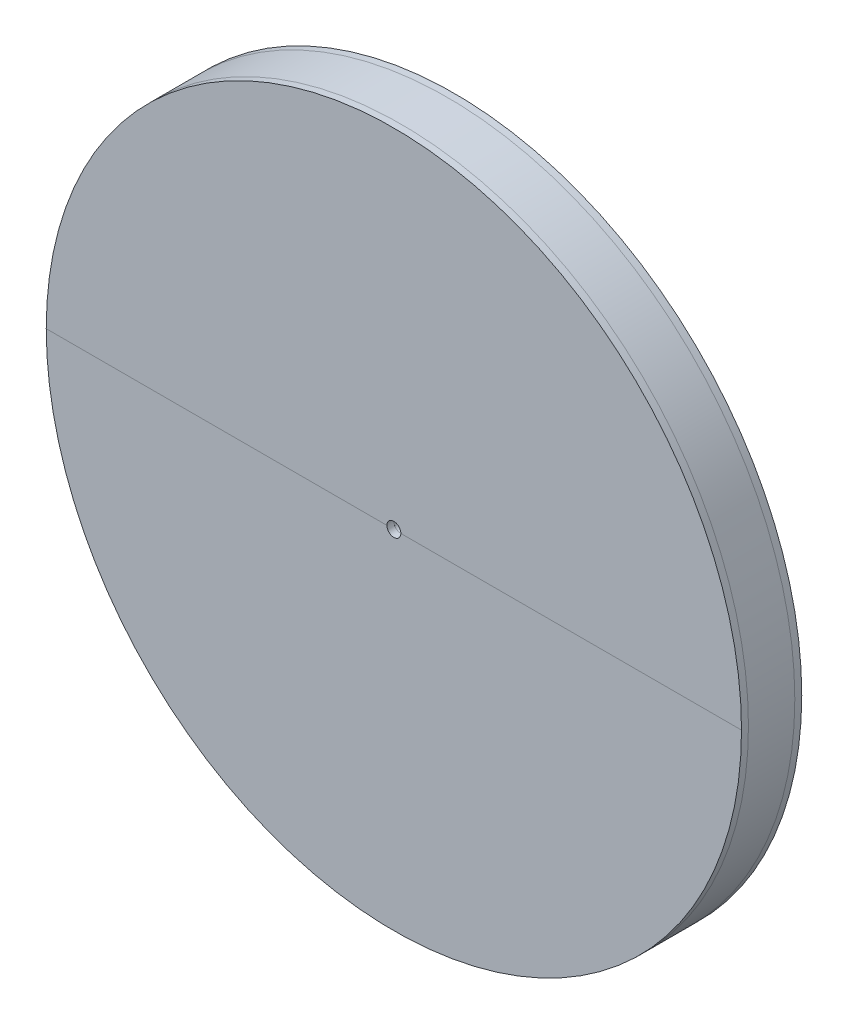
ISO-10303-21;
HEADER;
FILE_DESCRIPTION(('STEP AP214'),'2;1');
FILE_NAME('part.step','',(''),(''),'','','');
FILE_SCHEMA(('AUTOMOTIVE_DESIGN { 1 0 10303 214 1 1 1 1 }'));
ENDSEC;
DATA;
#1=APPLICATION_CONTEXT('core data for automotive mechanical design processes');
#2=APPLICATION_PROTOCOL_DEFINITION('international standard','automotive_design',2000,#1);
#3=PRODUCT_CONTEXT('',#1,'mechanical');
#4=PRODUCT('Part','Part','',(#3));
#5=PRODUCT_RELATED_PRODUCT_CATEGORY('part','',(#4));
#6=PRODUCT_DEFINITION_FORMATION('','',#4);
#7=PRODUCT_DEFINITION_CONTEXT('part definition',#1,'design');
#8=PRODUCT_DEFINITION('design','',#6,#7);
#9=PRODUCT_DEFINITION_SHAPE('','',#8);
#10=(LENGTH_UNIT() NAMED_UNIT(*) SI_UNIT(.MILLI.,.METRE.));
#11=(NAMED_UNIT(*) PLANE_ANGLE_UNIT() SI_UNIT($,.RADIAN.));
#12=(NAMED_UNIT(*) SI_UNIT($,.STERADIAN.) SOLID_ANGLE_UNIT());
#13=UNCERTAINTY_MEASURE_WITH_UNIT(LENGTH_MEASURE(1.E-05),#10,'distance_accuracy_value','');
#14=(GEOMETRIC_REPRESENTATION_CONTEXT(3) GLOBAL_UNCERTAINTY_ASSIGNED_CONTEXT((#13)) GLOBAL_UNIT_ASSIGNED_CONTEXT((#10,
#11,#12)) REPRESENTATION_CONTEXT('',''));
#15=CARTESIAN_POINT('',(0.,0.,0.));
#16=DIRECTION('',(0.,0.,1.));
#17=DIRECTION('',(1.,0.,0.));
#18=AXIS2_PLACEMENT_3D('',#15,#16,#17);
#19=CARTESIAN_POINT('',(0.,0.,13.));
#20=DIRECTION('',(0.,0.,1.));
#21=DIRECTION('',(-1.,0.,0.));
#22=AXIS2_PLACEMENT_3D('',#19,#20,#21);
#23=PLANE('',#22);
#24=CARTESIAN_POINT('',(0.,0.,13.));
#25=DIRECTION('',(0.,0.,-1.));
#26=DIRECTION('',(-1.,0.,0.));
#27=AXIS2_PLACEMENT_3D('',#24,#25,#26);
#28=CIRCLE('',#27,150.);
#29=CARTESIAN_POINT('',(150.,0.,13.));
#30=VERTEX_POINT('',#29);
#31=CARTESIAN_POINT('',(-150.,0.,13.));
#32=VERTEX_POINT('',#31);
#33=EDGE_CURVE('E75',#30,#32,#28,.T.);
#34=ORIENTED_EDGE('',*,*,#33,.F.);
#35=DIRECTION('',(-1.,0.,0.));
#36=VECTOR('',#35,1.);
#37=CARTESIAN_POINT('',(0.,0.,13.));
#38=LINE('',#37,#36);
#39=CARTESIAN_POINT('',(3.,0.,13.));
#40=VERTEX_POINT('',#39);
#41=EDGE_CURVE('E12',#30,#40,#38,.T.);
#42=ORIENTED_EDGE('',*,*,#41,.T.);
#43=CARTESIAN_POINT('',(0.,0.,13.));
#44=DIRECTION('',(0.,0.,-1.));
#45=DIRECTION('',(-1.,0.,0.));
#46=AXIS2_PLACEMENT_3D('',#43,#44,#45);
#47=CIRCLE('',#46,3.);
#48=CARTESIAN_POINT('',(-3.,0.,13.));
#49=VERTEX_POINT('',#48);
#50=EDGE_CURVE('E77',#40,#49,#47,.T.);
#51=ORIENTED_EDGE('',*,*,#50,.T.);
#52=EDGE_CURVE('E53',#49,#32,#38,.T.);
#53=ORIENTED_EDGE('',*,*,#52,.T.);
#54=EDGE_LOOP('',(#34,#42,#51,#53));
#55=FACE_BOUND('',#54,.T.);
#56=ADVANCED_FACE('F49',(#55),#23,.T.);
#57=ORIENTED_EDGE('',*,*,#41,.F.);
#58=EDGE_CURVE('E80',#32,#30,#28,.T.);
#59=ORIENTED_EDGE('',*,*,#58,.F.);
#60=ORIENTED_EDGE('',*,*,#52,.F.);
#61=EDGE_CURVE('E90',#49,#40,#47,.T.);
#62=ORIENTED_EDGE('',*,*,#61,.T.);
#63=EDGE_LOOP('',(#57,#59,#60,#62));
#64=FACE_BOUND('',#63,.T.);
#65=ADVANCED_FACE('F85',(#64),#23,.T.);
#66=CARTESIAN_POINT('',(0.,0.,10.));
#67=DIRECTION('',(0.,0.,1.));
#68=DIRECTION('',(-1.,0.,0.));
#69=AXIS2_PLACEMENT_3D('',#66,#67,#68);
#70=PLANE('',#69);
#71=CARTESIAN_POINT('',(0.,0.,10.));
#72=DIRECTION('',(0.,0.,-1.));
#73=DIRECTION('',(-1.,0.,0.));
#74=AXIS2_PLACEMENT_3D('',#71,#72,#73);
#75=CIRCLE('',#74,150.);
#76=CARTESIAN_POINT('',(-150.,0.,10.));
#77=VERTEX_POINT('',#76);
#78=EDGE_CURVE('E83',#77,#77,#75,.T.);
#79=ORIENTED_EDGE('',*,*,#78,.T.);
#80=EDGE_LOOP('',(#79));
#81=FACE_BOUND('',#80,.T.);
#82=CARTESIAN_POINT('',(0.,0.,10.));
#83=DIRECTION('',(0.,0.,-1.));
#84=DIRECTION('',(-1.,0.,0.));
#85=AXIS2_PLACEMENT_3D('',#82,#83,#84);
#86=CIRCLE('',#85,3.);
#87=CARTESIAN_POINT('',(-3.,0.,10.));
#88=VERTEX_POINT('',#87);
#89=EDGE_CURVE('E87',#88,#88,#86,.T.);
#90=ORIENTED_EDGE('',*,*,#89,.F.);
#91=EDGE_LOOP('',(#90));
#92=FACE_BOUND('',#91,.T.);
#93=ADVANCED_FACE('F98',(#81,#92),#70,.F.);
#94=CARTESIAN_POINT('',(0.,0.,13.));
#95=DIRECTION('',(0.,0.,-1.));
#96=DIRECTION('',(1.,0.,0.));
#97=AXIS2_PLACEMENT_3D('',#94,#95,#96);
#98=CYLINDRICAL_SURFACE('',#97,150.);
#99=ORIENTED_EDGE('',*,*,#58,.T.);
#100=ORIENTED_EDGE('',*,*,#33,.T.);
#101=EDGE_LOOP('',(#99,#100));
#102=FACE_BOUND('',#101,.T.);
#103=ORIENTED_EDGE('',*,*,#78,.F.);
#104=EDGE_LOOP('',(#103));
#105=FACE_BOUND('',#104,.T.);
#106=ADVANCED_FACE('F51',(#102,#105),#98,.T.);
#107=CARTESIAN_POINT('',(0.,0.,13.));
#108=DIRECTION('',(0.,0.,-1.));
#109=DIRECTION('',(1.,0.,0.));
#110=AXIS2_PLACEMENT_3D('',#107,#108,#109);
#111=CYLINDRICAL_SURFACE('',#110,3.);
#112=ORIENTED_EDGE('',*,*,#61,.F.);
#113=ORIENTED_EDGE('',*,*,#50,.F.);
#114=EDGE_LOOP('',(#112,#113));
#115=FACE_BOUND('',#114,.T.);
#116=ORIENTED_EDGE('',*,*,#89,.T.);
#117=EDGE_LOOP('',(#116));
#118=FACE_BOUND('',#117,.T.);
#119=ADVANCED_FACE('F96',(#115,#118),#111,.F.);
#120=CLOSED_SHELL('',(#56,#65,#93,#106,#119));
#121=MANIFOLD_SOLID_BREP('B2',#120);
#122=CARTESIAN_POINT('',(0.,0.,-13.));
#123=DIRECTION('',(0.,0.,-1.));
#124=DIRECTION('',(-1.,0.,0.));
#125=AXIS2_PLACEMENT_3D('',#122,#123,#124);
#126=PLANE('',#125);
#127=CARTESIAN_POINT('',(0.,0.,-13.));
#128=DIRECTION('',(0.,0.,-1.));
#129=DIRECTION('',(-1.,0.,0.));
#130=AXIS2_PLACEMENT_3D('',#127,#128,#129);
#131=CIRCLE('',#130,150.);
#132=CARTESIAN_POINT('',(-150.,0.,-13.));
#133=VERTEX_POINT('',#132);
#134=EDGE_CURVE('E48',#133,#133,#131,.T.);
#135=ORIENTED_EDGE('',*,*,#134,.T.);
#136=EDGE_LOOP('',(#135));
#137=FACE_BOUND('',#136,.T.);
#138=CARTESIAN_POINT('',(0.,0.,-13.));
#139=DIRECTION('',(0.,0.,-1.));
#140=DIRECTION('',(-1.,0.,0.));
#141=AXIS2_PLACEMENT_3D('',#138,#139,#140);
#142=CIRCLE('',#141,3.);
#143=CARTESIAN_POINT('',(-3.,0.,-13.));
#144=VERTEX_POINT('',#143);
#145=EDGE_CURVE('E163',#144,#144,#142,.T.);
#146=ORIENTED_EDGE('',*,*,#145,.F.);
#147=EDGE_LOOP('',(#146));
#148=FACE_BOUND('',#147,.T.);
#149=ADVANCED_FACE('F152',(#137,#148),#126,.T.);
#150=CARTESIAN_POINT('',(0.,0.,-10.));
#151=DIRECTION('',(0.,0.,-1.));
#152=DIRECTION('',(-1.,0.,0.));
#153=AXIS2_PLACEMENT_3D('',#150,#151,#152);
#154=PLANE('',#153);
#155=CARTESIAN_POINT('',(0.,0.,-10.));
#156=DIRECTION('',(0.,0.,-1.));
#157=DIRECTION('',(-1.,0.,0.));
#158=AXIS2_PLACEMENT_3D('',#155,#156,#157);
#159=CIRCLE('',#158,150.);
#160=CARTESIAN_POINT('',(-150.,0.,-10.));
#161=VERTEX_POINT('',#160);
#162=EDGE_CURVE('E156',#161,#161,#159,.T.);
#163=ORIENTED_EDGE('',*,*,#162,.F.);
#164=EDGE_LOOP('',(#163));
#165=FACE_BOUND('',#164,.T.);
#166=CARTESIAN_POINT('',(0.,0.,-10.));
#167=DIRECTION('',(0.,0.,-1.));
#168=DIRECTION('',(-1.,0.,0.));
#169=AXIS2_PLACEMENT_3D('',#166,#167,#168);
#170=CIRCLE('',#169,3.);
#171=CARTESIAN_POINT('',(-3.,0.,-10.));
#172=VERTEX_POINT('',#171);
#173=EDGE_CURVE('E165',#172,#172,#170,.T.);
#174=ORIENTED_EDGE('',*,*,#173,.T.);
#175=EDGE_LOOP('',(#174));
#176=FACE_BOUND('',#175,.T.);
#177=ADVANCED_FACE('F175',(#165,#176),#154,.F.);
#178=CARTESIAN_POINT('',(0.,0.,-13.));
#179=DIRECTION('',(0.,0.,1.));
#180=DIRECTION('',(1.,0.,0.));
#181=AXIS2_PLACEMENT_3D('',#178,#179,#180);
#182=CYLINDRICAL_SURFACE('',#181,150.);
#183=ORIENTED_EDGE('',*,*,#134,.F.);
#184=EDGE_LOOP('',(#183));
#185=FACE_BOUND('',#184,.T.);
#186=ORIENTED_EDGE('',*,*,#162,.T.);
#187=EDGE_LOOP('',(#186));
#188=FACE_BOUND('',#187,.T.);
#189=ADVANCED_FACE('F154',(#185,#188),#182,.T.);
#190=CARTESIAN_POINT('',(0.,0.,-13.));
#191=DIRECTION('',(0.,0.,1.));
#192=DIRECTION('',(1.,0.,0.));
#193=AXIS2_PLACEMENT_3D('',#190,#191,#192);
#194=CYLINDRICAL_SURFACE('',#193,3.);
#195=ORIENTED_EDGE('',*,*,#145,.T.);
#196=EDGE_LOOP('',(#195));
#197=FACE_BOUND('',#196,.T.);
#198=ORIENTED_EDGE('',*,*,#173,.F.);
#199=EDGE_LOOP('',(#198));
#200=FACE_BOUND('',#199,.T.);
#201=ADVANCED_FACE('F171',(#197,#200),#194,.F.);
#202=CLOSED_SHELL('',(#149,#177,#189,#201));
#203=MANIFOLD_SOLID_BREP('B6',#202);
#204=CARTESIAN_POINT('',(0.,0.,10.));
#205=DIRECTION('',(0.,0.,1.));
#206=DIRECTION('',(1.,0.,0.));
#207=AXIS2_PLACEMENT_3D('',#204,#205,#206);
#208=PLANE('',#207);
#209=DIRECTION('',(0.,1.,0.));
#210=VECTOR('',#209,1.);
#211=CARTESIAN_POINT('',(15.,-20.,10.));
#212=LINE('',#211,#210);
#213=CARTESIAN_POINT('',(15.,-139.194109070751,10.));
#214=VERTEX_POINT('',#213);
#215=CARTESIAN_POINT('',(15.,-20.,10.));
#216=VERTEX_POINT('',#215);
#217=EDGE_CURVE('E303',#214,#216,#212,.T.);
#218=ORIENTED_EDGE('',*,*,#217,.F.);
#219=CARTESIAN_POINT('',(0.,0.,10.));
#220=DIRECTION('',(0.,0.,1.));
#221=DIRECTION('',(1.,0.,0.));
#222=AXIS2_PLACEMENT_3D('',#219,#220,#221);
#223=CIRCLE('',#222,140.);
#224=CARTESIAN_POINT('',(-15.,-139.194109070751,10.));
#225=VERTEX_POINT('',#224);
#226=EDGE_CURVE('E295',#225,#214,#223,.T.);
#227=ORIENTED_EDGE('',*,*,#226,.F.);
#228=DIRECTION('',(0.,-1.,0.));
#229=VECTOR('',#228,1.);
#230=CARTESIAN_POINT('',(-15.,-20.,10.));
#231=LINE('',#230,#229);
#232=CARTESIAN_POINT('',(-15.,-20.,10.));
#233=VERTEX_POINT('',#232);
#234=EDGE_CURVE('E318',#233,#225,#231,.T.);
#235=ORIENTED_EDGE('',*,*,#234,.F.);
#236=DIRECTION('',(-1.,0.,0.));
#237=VECTOR('',#236,1.);
#238=CARTESIAN_POINT('',(-15.,-20.,10.));
#239=LINE('',#238,#237);
#240=EDGE_CURVE('E316',#216,#233,#239,.T.);
#241=ORIENTED_EDGE('',*,*,#240,.F.);
#242=EDGE_LOOP('',(#218,#227,#235,#241));
#243=FACE_BOUND('',#242,.T.);
#244=DIRECTION('',(0.,1.,0.));
#245=VECTOR('',#244,1.);
#246=CARTESIAN_POINT('',(-25.,137.749773139559,10.));
#247=LINE('',#246,#245);
#248=CARTESIAN_POINT('',(-25.,-137.749773139559,10.));
#249=VERTEX_POINT('',#248);
#250=CARTESIAN_POINT('',(-25.,137.749773139559,10.));
#251=VERTEX_POINT('',#250);
#252=EDGE_CURVE('E337',#249,#251,#247,.T.);
#253=ORIENTED_EDGE('',*,*,#252,.F.);
#254=CARTESIAN_POINT('',(0.,0.,10.));
#255=DIRECTION('',(0.,0.,1.));
#256=DIRECTION('',(1.,0.,0.));
#257=AXIS2_PLACEMENT_3D('',#254,#255,#256);
#258=CIRCLE('',#257,140.);
#259=EDGE_CURVE('E334',#251,#249,#258,.T.);
#260=ORIENTED_EDGE('',*,*,#259,.F.);
#261=EDGE_LOOP('',(#253,#260));
#262=FACE_BOUND('',#261,.T.);
#263=DIRECTION('',(0.,-1.,0.));
#264=VECTOR('',#263,1.);
#265=CARTESIAN_POINT('',(25.,137.749773139559,10.));
#266=LINE('',#265,#264);
#267=CARTESIAN_POINT('',(25.,137.749773139559,10.));
#268=VERTEX_POINT('',#267);
#269=CARTESIAN_POINT('',(25.,-137.749773139559,10.));
#270=VERTEX_POINT('',#269);
#271=EDGE_CURVE('E354',#268,#270,#266,.T.);
#272=ORIENTED_EDGE('',*,*,#271,.F.);
#273=CARTESIAN_POINT('',(0.,0.,10.));
#274=DIRECTION('',(0.,0.,1.));
#275=DIRECTION('',(1.,0.,0.));
#276=AXIS2_PLACEMENT_3D('',#273,#274,#275);
#277=CIRCLE('',#276,140.);
#278=EDGE_CURVE('E351',#270,#268,#277,.T.);
#279=ORIENTED_EDGE('',*,*,#278,.F.);
#280=EDGE_LOOP('',(#272,#279));
#281=FACE_BOUND('',#280,.T.);
#282=DIRECTION('',(0.,-1.,0.));
#283=VECTOR('',#282,1.);
#284=CARTESIAN_POINT('',(-15.,139.194109070751,10.));
#285=LINE('',#284,#283);
#286=CARTESIAN_POINT('',(-15.,139.194109070751,10.));
#287=VERTEX_POINT('',#286);
#288=CARTESIAN_POINT('',(-15.,20.,10.));
#289=VERTEX_POINT('',#288);
#290=EDGE_CURVE('E370',#287,#289,#285,.T.);
#291=ORIENTED_EDGE('',*,*,#290,.F.);
#292=CARTESIAN_POINT('',(0.,0.,10.));
#293=DIRECTION('',(0.,0.,1.));
#294=DIRECTION('',(1.,0.,0.));
#295=AXIS2_PLACEMENT_3D('',#292,#293,#294);
#296=CIRCLE('',#295,140.);
#297=CARTESIAN_POINT('',(15.,139.194109070751,10.));
#298=VERTEX_POINT('',#297);
#299=EDGE_CURVE('E368',#298,#287,#296,.T.);
#300=ORIENTED_EDGE('',*,*,#299,.F.);
#301=DIRECTION('',(0.,1.,0.));
#302=VECTOR('',#301,1.);
#303=CARTESIAN_POINT('',(15.,139.194109070751,10.));
#304=LINE('',#303,#302);
#305=CARTESIAN_POINT('',(15.,20.,10.));
#306=VERTEX_POINT('',#305);
#307=EDGE_CURVE('E376',#306,#298,#304,.T.);
#308=ORIENTED_EDGE('',*,*,#307,.F.);
#309=DIRECTION('',(1.,0.,0.));
#310=VECTOR('',#309,1.);
#311=CARTESIAN_POINT('',(-15.,20.,10.));
#312=LINE('',#311,#310);
#313=EDGE_CURVE('E373',#289,#306,#312,.T.);
#314=ORIENTED_EDGE('',*,*,#313,.F.);
#315=EDGE_LOOP('',(#291,#300,#308,#314));
#316=FACE_BOUND('',#315,.T.);
#317=CARTESIAN_POINT('',(0.,0.,10.));
#318=DIRECTION('',(0.,0.,1.));
#319=DIRECTION('',(1.,0.,0.));
#320=AXIS2_PLACEMENT_3D('',#317,#318,#319);
#321=CIRCLE('',#320,150.);
#322=CARTESIAN_POINT('',(150.,0.,10.));
#323=VERTEX_POINT('',#322);
#324=EDGE_CURVE('E150',#323,#323,#321,.T.);
#325=ORIENTED_EDGE('',*,*,#324,.T.);
#326=EDGE_LOOP('',(#325));
#327=FACE_BOUND('',#326,.T.);
#328=CARTESIAN_POINT('',(0.,0.,10.));
#329=DIRECTION('',(0.,0.,1.));
#330=DIRECTION('',(1.,0.,0.));
#331=AXIS2_PLACEMENT_3D('',#328,#329,#330);
#332=CIRCLE('',#331,3.);
#333=CARTESIAN_POINT('',(3.,0.,10.));
#334=VERTEX_POINT('',#333);
#335=EDGE_CURVE('E324',#334,#334,#332,.T.);
#336=ORIENTED_EDGE('',*,*,#335,.F.);
#337=EDGE_LOOP('',(#336));
#338=FACE_BOUND('',#337,.T.);
#339=ADVANCED_FACE('F206',(#243,#262,#281,#316,#327,#338),#208,.T.);
#340=CARTESIAN_POINT('',(0.,0.,-10.));
#341=DIRECTION('',(0.,0.,1.));
#342=DIRECTION('',(1.,0.,0.));
#343=AXIS2_PLACEMENT_3D('',#340,#341,#342);
#344=PLANE('',#343);
#345=CARTESIAN_POINT('',(0.,0.,-10.));
#346=DIRECTION('',(0.,0.,1.));
#347=DIRECTION('',(1.,0.,0.));
#348=AXIS2_PLACEMENT_3D('',#345,#346,#347);
#349=CIRCLE('',#348,140.);
#350=CARTESIAN_POINT('',(-25.,137.749773139559,-10.));
#351=VERTEX_POINT('',#350);
#352=CARTESIAN_POINT('',(-25.,-137.749773139559,-10.));
#353=VERTEX_POINT('',#352);
#354=EDGE_CURVE('E311',#351,#353,#349,.T.);
#355=ORIENTED_EDGE('',*,*,#354,.T.);
#356=DIRECTION('',(0.,1.,0.));
#357=VECTOR('',#356,1.);
#358=CARTESIAN_POINT('',(-25.,137.749773139559,-10.));
#359=LINE('',#358,#357);
#360=EDGE_CURVE('E338',#353,#351,#359,.T.);
#361=ORIENTED_EDGE('',*,*,#360,.T.);
#362=EDGE_LOOP('',(#355,#361));
#363=FACE_BOUND('',#362,.T.);
#364=CARTESIAN_POINT('',(0.,0.,-10.));
#365=DIRECTION('',(0.,0.,1.));
#366=DIRECTION('',(1.,0.,0.));
#367=AXIS2_PLACEMENT_3D('',#364,#365,#366);
#368=CIRCLE('',#367,140.);
#369=CARTESIAN_POINT('',(15.,139.194109070751,-10.));
#370=VERTEX_POINT('',#369);
#371=CARTESIAN_POINT('',(-15.,139.194109070751,-10.));
#372=VERTEX_POINT('',#371);
#373=EDGE_CURVE('E367',#370,#372,#368,.T.);
#374=ORIENTED_EDGE('',*,*,#373,.T.);
#375=DIRECTION('',(0.,-1.,0.));
#376=VECTOR('',#375,1.);
#377=CARTESIAN_POINT('',(-15.,139.194109070751,-10.));
#378=LINE('',#377,#376);
#379=CARTESIAN_POINT('',(-15.,20.,-10.));
#380=VERTEX_POINT('',#379);
#381=EDGE_CURVE('E381',#372,#380,#378,.T.);
#382=ORIENTED_EDGE('',*,*,#381,.T.);
#383=DIRECTION('',(1.,0.,0.));
#384=VECTOR('',#383,1.);
#385=CARTESIAN_POINT('',(-15.,20.,-10.));
#386=LINE('',#385,#384);
#387=CARTESIAN_POINT('',(15.,20.,-10.));
#388=VERTEX_POINT('',#387);
#389=EDGE_CURVE('E384',#380,#388,#386,.T.);
#390=ORIENTED_EDGE('',*,*,#389,.T.);
#391=DIRECTION('',(0.,1.,0.));
#392=VECTOR('',#391,1.);
#393=CARTESIAN_POINT('',(15.,139.194109070751,-10.));
#394=LINE('',#393,#392);
#395=EDGE_CURVE('E371',#388,#370,#394,.T.);
#396=ORIENTED_EDGE('',*,*,#395,.T.);
#397=EDGE_LOOP('',(#374,#382,#390,#396));
#398=FACE_BOUND('',#397,.T.);
#399=CARTESIAN_POINT('',(0.,0.,-10.));
#400=DIRECTION('',(0.,0.,1.));
#401=DIRECTION('',(1.,0.,0.));
#402=AXIS2_PLACEMENT_3D('',#399,#400,#401);
#403=CIRCLE('',#402,150.);
#404=CARTESIAN_POINT('',(150.,0.,-10.));
#405=VERTEX_POINT('',#404);
#406=EDGE_CURVE('E210',#405,#405,#403,.T.);
#407=ORIENTED_EDGE('',*,*,#406,.F.);
#408=EDGE_LOOP('',(#407));
#409=FACE_BOUND('',#408,.T.);
#410=CARTESIAN_POINT('',(0.,0.,-10.));
#411=DIRECTION('',(0.,0.,1.));
#412=DIRECTION('',(1.,0.,0.));
#413=AXIS2_PLACEMENT_3D('',#410,#411,#412);
#414=CIRCLE('',#413,140.);
#415=CARTESIAN_POINT('',(25.,-137.749773139559,-10.));
#416=VERTEX_POINT('',#415);
#417=CARTESIAN_POINT('',(25.,137.749773139559,-10.));
#418=VERTEX_POINT('',#417);
#419=EDGE_CURVE('E350',#416,#418,#414,.T.);
#420=ORIENTED_EDGE('',*,*,#419,.T.);
#421=DIRECTION('',(0.,-1.,0.));
#422=VECTOR('',#421,1.);
#423=CARTESIAN_POINT('',(25.,137.749773139559,-10.));
#424=LINE('',#423,#422);
#425=EDGE_CURVE('E355',#418,#416,#424,.T.);
#426=ORIENTED_EDGE('',*,*,#425,.T.);
#427=EDGE_LOOP('',(#420,#426));
#428=FACE_BOUND('',#427,.T.);
#429=CARTESIAN_POINT('',(0.,0.,-10.));
#430=DIRECTION('',(0.,0.,1.));
#431=DIRECTION('',(1.,0.,0.));
#432=AXIS2_PLACEMENT_3D('',#429,#430,#431);
#433=CIRCLE('',#432,140.);
#434=CARTESIAN_POINT('',(-15.,-139.194109070751,-10.));
#435=VERTEX_POINT('',#434);
#436=CARTESIAN_POINT('',(15.,-139.194109070751,-10.));
#437=VERTEX_POINT('',#436);
#438=EDGE_CURVE('E229',#435,#437,#433,.T.);
#439=ORIENTED_EDGE('',*,*,#438,.T.);
#440=DIRECTION('',(0.,1.,0.));
#441=VECTOR('',#440,1.);
#442=CARTESIAN_POINT('',(15.,-20.,-10.));
#443=LINE('',#442,#441);
#444=CARTESIAN_POINT('',(15.,-20.,-10.));
#445=VERTEX_POINT('',#444);
#446=EDGE_CURVE('E310',#437,#445,#443,.T.);
#447=ORIENTED_EDGE('',*,*,#446,.T.);
#448=DIRECTION('',(-1.,0.,0.));
#449=VECTOR('',#448,1.);
#450=CARTESIAN_POINT('',(-15.,-20.,-10.));
#451=LINE('',#450,#449);
#452=CARTESIAN_POINT('',(-15.,-20.,-10.));
#453=VERTEX_POINT('',#452);
#454=EDGE_CURVE('E326',#445,#453,#451,.T.);
#455=ORIENTED_EDGE('',*,*,#454,.T.);
#456=DIRECTION('',(0.,-1.,0.));
#457=VECTOR('',#456,1.);
#458=CARTESIAN_POINT('',(-15.,-20.,-10.));
#459=LINE('',#458,#457);
#460=EDGE_CURVE('E304',#453,#435,#459,.T.);
#461=ORIENTED_EDGE('',*,*,#460,.T.);
#462=EDGE_LOOP('',(#439,#447,#455,#461));
#463=FACE_BOUND('',#462,.T.);
#464=CARTESIAN_POINT('',(0.,0.,-10.));
#465=DIRECTION('',(0.,0.,1.));
#466=DIRECTION('',(1.,0.,0.));
#467=AXIS2_PLACEMENT_3D('',#464,#465,#466);
#468=CIRCLE('',#467,3.);
#469=CARTESIAN_POINT('',(3.,0.,-10.));
#470=VERTEX_POINT('',#469);
#471=EDGE_CURVE('E411',#470,#470,#468,.T.);
#472=ORIENTED_EDGE('',*,*,#471,.T.);
#473=EDGE_LOOP('',(#472));
#474=FACE_BOUND('',#473,.T.);
#475=ADVANCED_FACE('F403',(#363,#398,#409,#428,#463,#474),#344,.F.);
#476=CARTESIAN_POINT('',(0.,0.,10.));
#477=DIRECTION('',(0.,0.,-1.));
#478=DIRECTION('',(-1.,0.,0.));
#479=AXIS2_PLACEMENT_3D('',#476,#477,#478);
#480=CYLINDRICAL_SURFACE('',#479,150.);
#481=ORIENTED_EDGE('',*,*,#324,.F.);
#482=EDGE_LOOP('',(#481));
#483=FACE_BOUND('',#482,.T.);
#484=ORIENTED_EDGE('',*,*,#406,.T.);
#485=EDGE_LOOP('',(#484));
#486=FACE_BOUND('',#485,.T.);
#487=ADVANCED_FACE('F208',(#483,#486),#480,.T.);
#488=CARTESIAN_POINT('',(0.,0.,10.));
#489=DIRECTION('',(0.,0.,-1.));
#490=DIRECTION('',(-1.,0.,0.));
#491=AXIS2_PLACEMENT_3D('',#488,#489,#490);
#492=CYLINDRICAL_SURFACE('',#491,140.);
#493=ORIENTED_EDGE('',*,*,#373,.F.);
#494=DIRECTION('',(0.,0.,-1.));
#495=VECTOR('',#494,1.);
#496=CARTESIAN_POINT('',(15.,139.194109070751,10.));
#497=LINE('',#496,#495);
#498=EDGE_CURVE('E378',#298,#370,#497,.T.);
#499=ORIENTED_EDGE('',*,*,#498,.F.);
#500=ORIENTED_EDGE('',*,*,#299,.T.);
#501=DIRECTION('',(0.,0.,-1.));
#502=VECTOR('',#501,1.);
#503=CARTESIAN_POINT('',(-15.,139.194109070751,10.));
#504=LINE('',#503,#502);
#505=EDGE_CURVE('E395',#287,#372,#504,.T.);
#506=ORIENTED_EDGE('',*,*,#505,.T.);
#507=EDGE_LOOP('',(#493,#499,#500,#506));
#508=FACE_BOUND('',#507,.T.);
#509=ADVANCED_FACE('F424',(#508),#492,.F.);
#510=CARTESIAN_POINT('',(-15.,139.194109070751,10.));
#511=DIRECTION('',(1.,0.,0.));
#512=DIRECTION('',(0.,1.,0.));
#513=AXIS2_PLACEMENT_3D('',#510,#511,#512);
#514=PLANE('',#513);
#515=ORIENTED_EDGE('',*,*,#381,.F.);
#516=ORIENTED_EDGE('',*,*,#505,.F.);
#517=ORIENTED_EDGE('',*,*,#290,.T.);
#518=DIRECTION('',(0.,0.,-1.));
#519=VECTOR('',#518,1.);
#520=CARTESIAN_POINT('',(-15.,20.,10.));
#521=LINE('',#520,#519);
#522=EDGE_CURVE('E393',#289,#380,#521,.T.);
#523=ORIENTED_EDGE('',*,*,#522,.T.);
#524=EDGE_LOOP('',(#515,#516,#517,#523));
#525=FACE_BOUND('',#524,.T.);
#526=ADVANCED_FACE('F427',(#525),#514,.T.);
#527=CARTESIAN_POINT('',(-15.,20.,10.));
#528=DIRECTION('',(0.,1.,0.));
#529=DIRECTION('',(-1.,0.,0.));
#530=AXIS2_PLACEMENT_3D('',#527,#528,#529);
#531=PLANE('',#530);
#532=ORIENTED_EDGE('',*,*,#389,.F.);
#533=ORIENTED_EDGE('',*,*,#522,.F.);
#534=ORIENTED_EDGE('',*,*,#313,.T.);
#535=DIRECTION('',(0.,0.,-1.));
#536=VECTOR('',#535,1.);
#537=CARTESIAN_POINT('',(15.,20.,10.));
#538=LINE('',#537,#536);
#539=EDGE_CURVE('E391',#306,#388,#538,.T.);
#540=ORIENTED_EDGE('',*,*,#539,.T.);
#541=EDGE_LOOP('',(#532,#533,#534,#540));
#542=FACE_BOUND('',#541,.T.);
#543=ADVANCED_FACE('F430',(#542),#531,.T.);
#544=CARTESIAN_POINT('',(15.,139.194109070751,10.));
#545=DIRECTION('',(-1.,0.,0.));
#546=DIRECTION('',(0.,-1.,0.));
#547=AXIS2_PLACEMENT_3D('',#544,#545,#546);
#548=PLANE('',#547);
#549=ORIENTED_EDGE('',*,*,#395,.F.);
#550=ORIENTED_EDGE('',*,*,#539,.F.);
#551=ORIENTED_EDGE('',*,*,#307,.T.);
#552=ORIENTED_EDGE('',*,*,#498,.T.);
#553=EDGE_LOOP('',(#549,#550,#551,#552));
#554=FACE_BOUND('',#553,.T.);
#555=ADVANCED_FACE('F434',(#554),#548,.T.);
#556=CARTESIAN_POINT('',(0.,0.,10.));
#557=DIRECTION('',(0.,0.,-1.));
#558=DIRECTION('',(-1.,0.,0.));
#559=AXIS2_PLACEMENT_3D('',#556,#557,#558);
#560=CYLINDRICAL_SURFACE('',#559,140.);
#561=ORIENTED_EDGE('',*,*,#419,.F.);
#562=DIRECTION('',(0.,0.,-1.));
#563=VECTOR('',#562,1.);
#564=CARTESIAN_POINT('',(25.,-137.749773139559,10.));
#565=LINE('',#564,#563);
#566=EDGE_CURVE('E357',#270,#416,#565,.T.);
#567=ORIENTED_EDGE('',*,*,#566,.F.);
#568=ORIENTED_EDGE('',*,*,#278,.T.);
#569=DIRECTION('',(0.,0.,-1.));
#570=VECTOR('',#569,1.);
#571=CARTESIAN_POINT('',(25.,137.749773139559,10.));
#572=LINE('',#571,#570);
#573=EDGE_CURVE('E364',#268,#418,#572,.T.);
#574=ORIENTED_EDGE('',*,*,#573,.T.);
#575=EDGE_LOOP('',(#561,#567,#568,#574));
#576=FACE_BOUND('',#575,.T.);
#577=ADVANCED_FACE('F438',(#576),#560,.F.);
#578=CARTESIAN_POINT('',(25.,137.749773139559,10.));
#579=DIRECTION('',(1.,0.,0.));
#580=DIRECTION('',(0.,0.,-1.));
#581=AXIS2_PLACEMENT_3D('',#578,#579,#580);
#582=PLANE('',#581);
#583=ORIENTED_EDGE('',*,*,#425,.F.);
#584=ORIENTED_EDGE('',*,*,#573,.F.);
#585=ORIENTED_EDGE('',*,*,#271,.T.);
#586=ORIENTED_EDGE('',*,*,#566,.T.);
#587=EDGE_LOOP('',(#583,#584,#585,#586));
#588=FACE_BOUND('',#587,.T.);
#589=ADVANCED_FACE('F442',(#588),#582,.T.);
#590=CARTESIAN_POINT('',(0.,0.,10.));
#591=DIRECTION('',(0.,0.,-1.));
#592=DIRECTION('',(-1.,0.,0.));
#593=AXIS2_PLACEMENT_3D('',#590,#591,#592);
#594=CYLINDRICAL_SURFACE('',#593,140.);
#595=ORIENTED_EDGE('',*,*,#354,.F.);
#596=DIRECTION('',(0.,0.,-1.));
#597=VECTOR('',#596,1.);
#598=CARTESIAN_POINT('',(-25.,137.749773139559,10.));
#599=LINE('',#598,#597);
#600=EDGE_CURVE('E340',#251,#351,#599,.T.);
#601=ORIENTED_EDGE('',*,*,#600,.F.);
#602=ORIENTED_EDGE('',*,*,#259,.T.);
#603=DIRECTION('',(0.,0.,-1.));
#604=VECTOR('',#603,1.);
#605=CARTESIAN_POINT('',(-25.,-137.749773139559,10.));
#606=LINE('',#605,#604);
#607=EDGE_CURVE('E347',#249,#353,#606,.T.);
#608=ORIENTED_EDGE('',*,*,#607,.T.);
#609=EDGE_LOOP('',(#595,#601,#602,#608));
#610=FACE_BOUND('',#609,.T.);
#611=ADVANCED_FACE('F446',(#610),#594,.F.);
#612=CARTESIAN_POINT('',(-25.,137.749773139559,10.));
#613=DIRECTION('',(-1.,0.,0.));
#614=DIRECTION('',(0.,0.,1.));
#615=AXIS2_PLACEMENT_3D('',#612,#613,#614);
#616=PLANE('',#615);
#617=ORIENTED_EDGE('',*,*,#360,.F.);
#618=ORIENTED_EDGE('',*,*,#607,.F.);
#619=ORIENTED_EDGE('',*,*,#252,.T.);
#620=ORIENTED_EDGE('',*,*,#600,.T.);
#621=EDGE_LOOP('',(#617,#618,#619,#620));
#622=FACE_BOUND('',#621,.T.);
#623=ADVANCED_FACE('F450',(#622),#616,.T.);
#624=CARTESIAN_POINT('',(0.,0.,10.));
#625=DIRECTION('',(0.,0.,-1.));
#626=DIRECTION('',(-1.,0.,0.));
#627=AXIS2_PLACEMENT_3D('',#624,#625,#626);
#628=CYLINDRICAL_SURFACE('',#627,140.);
#629=ORIENTED_EDGE('',*,*,#438,.F.);
#630=DIRECTION('',(0.,0.,-1.));
#631=VECTOR('',#630,1.);
#632=CARTESIAN_POINT('',(-15.,-139.194109070751,10.));
#633=LINE('',#632,#631);
#634=EDGE_CURVE('E299',#225,#435,#633,.T.);
#635=ORIENTED_EDGE('',*,*,#634,.F.);
#636=ORIENTED_EDGE('',*,*,#226,.T.);
#637=DIRECTION('',(0.,0.,-1.));
#638=VECTOR('',#637,1.);
#639=CARTESIAN_POINT('',(15.,-139.194109070751,10.));
#640=LINE('',#639,#638);
#641=EDGE_CURVE('E298',#214,#437,#640,.T.);
#642=ORIENTED_EDGE('',*,*,#641,.T.);
#643=EDGE_LOOP('',(#629,#635,#636,#642));
#644=FACE_BOUND('',#643,.T.);
#645=ADVANCED_FACE('F297',(#644),#628,.F.);
#646=CARTESIAN_POINT('',(15.,-20.,10.));
#647=DIRECTION('',(-1.,0.,0.));
#648=DIRECTION('',(0.,-1.,0.));
#649=AXIS2_PLACEMENT_3D('',#646,#647,#648);
#650=PLANE('',#649);
#651=ORIENTED_EDGE('',*,*,#446,.F.);
#652=ORIENTED_EDGE('',*,*,#641,.F.);
#653=ORIENTED_EDGE('',*,*,#217,.T.);
#654=DIRECTION('',(0.,0.,-1.));
#655=VECTOR('',#654,1.);
#656=CARTESIAN_POINT('',(15.,-20.,10.));
#657=LINE('',#656,#655);
#658=EDGE_CURVE('E312',#216,#445,#657,.T.);
#659=ORIENTED_EDGE('',*,*,#658,.T.);
#660=EDGE_LOOP('',(#651,#652,#653,#659));
#661=FACE_BOUND('',#660,.T.);
#662=ADVANCED_FACE('F307',(#661),#650,.T.);
#663=CARTESIAN_POINT('',(-15.,-20.,10.));
#664=DIRECTION('',(0.,-1.,0.));
#665=DIRECTION('',(1.,0.,0.));
#666=AXIS2_PLACEMENT_3D('',#663,#664,#665);
#667=PLANE('',#666);
#668=ORIENTED_EDGE('',*,*,#454,.F.);
#669=ORIENTED_EDGE('',*,*,#658,.F.);
#670=ORIENTED_EDGE('',*,*,#240,.T.);
#671=DIRECTION('',(0.,0.,-1.));
#672=VECTOR('',#671,1.);
#673=CARTESIAN_POINT('',(-15.,-20.,10.));
#674=LINE('',#673,#672);
#675=EDGE_CURVE('E221',#233,#453,#674,.T.);
#676=ORIENTED_EDGE('',*,*,#675,.T.);
#677=EDGE_LOOP('',(#668,#669,#670,#676));
#678=FACE_BOUND('',#677,.T.);
#679=ADVANCED_FACE('F459',(#678),#667,.T.);
#680=CARTESIAN_POINT('',(-15.,-20.,10.));
#681=DIRECTION('',(1.,0.,0.));
#682=DIRECTION('',(0.,1.,0.));
#683=AXIS2_PLACEMENT_3D('',#680,#681,#682);
#684=PLANE('',#683);
#685=ORIENTED_EDGE('',*,*,#460,.F.);
#686=ORIENTED_EDGE('',*,*,#675,.F.);
#687=ORIENTED_EDGE('',*,*,#234,.T.);
#688=ORIENTED_EDGE('',*,*,#634,.T.);
#689=EDGE_LOOP('',(#685,#686,#687,#688));
#690=FACE_BOUND('',#689,.T.);
#691=ADVANCED_FACE('F462',(#690),#684,.T.);
#692=CARTESIAN_POINT('',(0.,0.,10.));
#693=DIRECTION('',(0.,0.,-1.));
#694=DIRECTION('',(-1.,0.,0.));
#695=AXIS2_PLACEMENT_3D('',#692,#693,#694);
#696=CYLINDRICAL_SURFACE('',#695,3.);
#697=ORIENTED_EDGE('',*,*,#335,.T.);
#698=EDGE_LOOP('',(#697));
#699=FACE_BOUND('',#698,.T.);
#700=ORIENTED_EDGE('',*,*,#471,.F.);
#701=EDGE_LOOP('',(#700));
#702=FACE_BOUND('',#701,.T.);
#703=ADVANCED_FACE('F417',(#699,#702),#696,.F.);
#704=CLOSED_SHELL('',(#339,#475,#487,#509,#526,#543,#555,#577,#589,#611,#623,#645,#662,#679,
#691,#703));
#705=MANIFOLD_SOLID_BREP('B43',#704);
#706=ADVANCED_BREP_SHAPE_REPRESENTATION('',(#18,#121,#203,#705),#14);
#707=SHAPE_DEFINITION_REPRESENTATION(#9,#706);
ENDSEC;
END-ISO-10303-21;
